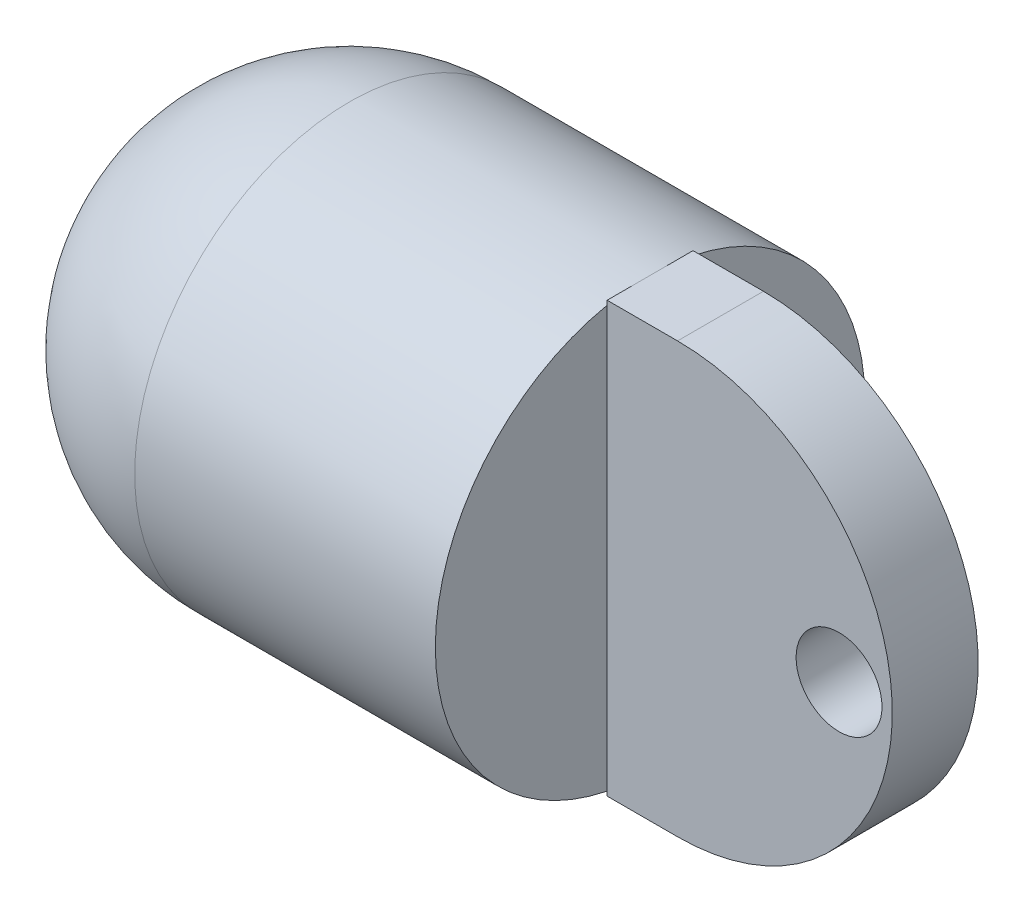
ISO-10303-21;
HEADER;
FILE_DESCRIPTION(('STEP AP214'),'2;1');
FILE_NAME('part.step','',(''),(''),'','','');
FILE_SCHEMA(('AUTOMOTIVE_DESIGN { 1 0 10303 214 1 1 1 1 }'));
ENDSEC;
DATA;
#1=APPLICATION_CONTEXT('core data for automotive mechanical design processes');
#2=APPLICATION_PROTOCOL_DEFINITION('international standard','automotive_design',2000,#1);
#3=PRODUCT_CONTEXT('',#1,'mechanical');
#4=PRODUCT('Part','Part','',(#3));
#5=PRODUCT_RELATED_PRODUCT_CATEGORY('part','',(#4));
#6=PRODUCT_DEFINITION_FORMATION('','',#4);
#7=PRODUCT_DEFINITION_CONTEXT('part definition',#1,'design');
#8=PRODUCT_DEFINITION('design','',#6,#7);
#9=PRODUCT_DEFINITION_SHAPE('','',#8);
#10=(LENGTH_UNIT() NAMED_UNIT(*) SI_UNIT(.MILLI.,.METRE.));
#11=(NAMED_UNIT(*) PLANE_ANGLE_UNIT() SI_UNIT($,.RADIAN.));
#12=(NAMED_UNIT(*) SI_UNIT($,.STERADIAN.) SOLID_ANGLE_UNIT());
#13=UNCERTAINTY_MEASURE_WITH_UNIT(LENGTH_MEASURE(1.E-05),#10,'distance_accuracy_value','');
#14=(GEOMETRIC_REPRESENTATION_CONTEXT(3) GLOBAL_UNCERTAINTY_ASSIGNED_CONTEXT((#13)) GLOBAL_UNIT_ASSIGNED_CONTEXT((#10,
#11,#12)) REPRESENTATION_CONTEXT('',''));
#15=CARTESIAN_POINT('',(0.,0.,0.));
#16=DIRECTION('',(0.,0.,1.));
#17=DIRECTION('',(1.,0.,0.));
#18=AXIS2_PLACEMENT_3D('',#15,#16,#17);
#19=CARTESIAN_POINT('',(0.,0.,0.));
#20=DIRECTION('',(1.,0.,0.));
#21=DIRECTION('',(0.,0.,-1.));
#22=AXIS2_PLACEMENT_3D('',#19,#20,#21);
#23=PLANE('',#22);
#24=DIRECTION('',(0.,1.,0.));
#25=VECTOR('',#24,1.);
#26=CARTESIAN_POINT('',(0.,12.5,-2.5));
#27=LINE('',#26,#25);
#28=CARTESIAN_POINT('',(0.,-12.2474487139159,-2.5));
#29=VERTEX_POINT('',#28);
#30=CARTESIAN_POINT('',(0.,12.2474487139159,-2.5));
#31=VERTEX_POINT('',#30);
#32=EDGE_CURVE('E11',#29,#31,#27,.T.);
#33=ORIENTED_EDGE('',*,*,#32,.F.);
#34=CARTESIAN_POINT('',(0.,0.,0.));
#35=DIRECTION('',(1.,0.,0.));
#36=DIRECTION('',(0.,0.,-1.));
#37=AXIS2_PLACEMENT_3D('',#34,#35,#36);
#38=CIRCLE('',#37,12.5);
#39=EDGE_CURVE('E165',#29,#31,#38,.T.);
#40=ORIENTED_EDGE('',*,*,#39,.T.);
#41=EDGE_LOOP('',(#33,#40));
#42=FACE_BOUND('',#41,.T.);
#43=ADVANCED_FACE('F39',(#42),#23,.T.);
#44=CARTESIAN_POINT('',(-17.5,0.,0.));
#45=DIRECTION('',(1.,0.,0.));
#46=DIRECTION('',(0.,0.,-1.));
#47=AXIS2_PLACEMENT_3D('',#44,#45,#46);
#48=CYLINDRICAL_SURFACE('',#47,12.5);
#49=CARTESIAN_POINT('',(-17.5,0.,0.));
#50=DIRECTION('',(1.,0.,0.));
#51=DIRECTION('',(0.,0.,-1.));
#52=AXIS2_PLACEMENT_3D('',#49,#50,#51);
#53=CIRCLE('',#52,12.5);
#54=CARTESIAN_POINT('',(-17.4999999999999,0.,-12.5));
#55=VERTEX_POINT('',#54);
#56=EDGE_CURVE('E243',#55,#55,#53,.T.);
#57=ORIENTED_EDGE('',*,*,#56,.T.);
#58=EDGE_LOOP('',(#57));
#59=FACE_BOUND('',#58,.T.);
#60=CARTESIAN_POINT('',(0.,12.5,0.));
#61=VERTEX_POINT('',#60);
#62=EDGE_CURVE('E166',#31,#61,#38,.T.);
#63=ORIENTED_EDGE('',*,*,#62,.F.);
#64=ORIENTED_EDGE('',*,*,#39,.F.);
#65=CARTESIAN_POINT('',(0.,-12.5,0.));
#66=VERTEX_POINT('',#65);
#67=EDGE_CURVE('E63',#66,#29,#38,.T.);
#68=ORIENTED_EDGE('',*,*,#67,.F.);
#69=CARTESIAN_POINT('',(0.,-12.2474487139159,2.5));
#70=VERTEX_POINT('',#69);
#71=EDGE_CURVE('E181',#70,#66,#38,.T.);
#72=ORIENTED_EDGE('',*,*,#71,.F.);
#73=CARTESIAN_POINT('',(0.,12.2474487139159,2.5));
#74=VERTEX_POINT('',#73);
#75=EDGE_CURVE('E178',#74,#70,#38,.T.);
#76=ORIENTED_EDGE('',*,*,#75,.F.);
#77=EDGE_CURVE('E169',#61,#74,#38,.T.);
#78=ORIENTED_EDGE('',*,*,#77,.F.);
#79=EDGE_LOOP('',(#63,#64,#68,#72,#76,#78));
#80=FACE_BOUND('',#79,.T.);
#81=ADVANCED_FACE('F41',(#59,#80),#48,.T.);
#82=DIRECTION('',(0.,-1.,0.));
#83=VECTOR('',#82,1.);
#84=CARTESIAN_POINT('',(0.,12.5,2.5));
#85=LINE('',#84,#83);
#86=EDGE_CURVE('E49',#74,#70,#85,.T.);
#87=ORIENTED_EDGE('',*,*,#86,.F.);
#88=ORIENTED_EDGE('',*,*,#75,.T.);
#89=EDGE_LOOP('',(#87,#88));
#90=FACE_BOUND('',#89,.T.);
#91=ADVANCED_FACE('F190',(#90),#23,.T.);
#92=CARTESIAN_POINT('',(0.,0.,0.));
#93=DIRECTION('',(-1.,0.,0.));
#94=DIRECTION('',(0.,0.,1.));
#95=AXIS2_PLACEMENT_3D('',#92,#93,#94);
#96=PLANE('',#95);
#97=CARTESIAN_POINT('',(0.,12.5,-2.5));
#98=VERTEX_POINT('',#97);
#99=EDGE_CURVE('E52',#31,#98,#27,.T.);
#100=ORIENTED_EDGE('',*,*,#99,.F.);
#101=ORIENTED_EDGE('',*,*,#62,.T.);
#102=DIRECTION('',(0.,0.,1.));
#103=VECTOR('',#102,1.);
#104=CARTESIAN_POINT('',(0.,12.5,2.5));
#105=LINE('',#104,#103);
#106=EDGE_CURVE('E146',#98,#61,#105,.T.);
#107=ORIENTED_EDGE('',*,*,#106,.F.);
#108=EDGE_LOOP('',(#100,#101,#107));
#109=FACE_BOUND('',#108,.T.);
#110=ADVANCED_FACE('F196',(#109),#96,.T.);
#111=CARTESIAN_POINT('',(0.,12.5,2.5));
#112=VERTEX_POINT('',#111);
#113=EDGE_CURVE('E139',#61,#112,#105,.T.);
#114=ORIENTED_EDGE('',*,*,#113,.F.);
#115=ORIENTED_EDGE('',*,*,#77,.T.);
#116=EDGE_CURVE('E150',#112,#74,#85,.T.);
#117=ORIENTED_EDGE('',*,*,#116,.F.);
#118=EDGE_LOOP('',(#114,#115,#117));
#119=FACE_BOUND('',#118,.T.);
#120=ADVANCED_FACE('F195',(#119),#96,.T.);
#121=CARTESIAN_POINT('',(0.,-12.5,2.5));
#122=VERTEX_POINT('',#121);
#123=EDGE_CURVE('E126',#70,#122,#85,.T.);
#124=ORIENTED_EDGE('',*,*,#123,.F.);
#125=ORIENTED_EDGE('',*,*,#71,.T.);
#126=DIRECTION('',(0.,0.,-1.));
#127=VECTOR('',#126,1.);
#128=CARTESIAN_POINT('',(0.,-12.5,2.5));
#129=LINE('',#128,#127);
#130=EDGE_CURVE('E154',#122,#66,#129,.T.);
#131=ORIENTED_EDGE('',*,*,#130,.F.);
#132=EDGE_LOOP('',(#124,#125,#131));
#133=FACE_BOUND('',#132,.T.);
#134=ADVANCED_FACE('F191',(#133),#96,.T.);
#135=CARTESIAN_POINT('',(4.1,12.5,2.5));
#136=DIRECTION('',(0.,-1.,0.));
#137=DIRECTION('',(0.,0.,-1.));
#138=AXIS2_PLACEMENT_3D('',#135,#136,#137);
#139=PLANE('',#138);
#140=ORIENTED_EDGE('',*,*,#106,.T.);
#141=ORIENTED_EDGE('',*,*,#113,.T.);
#142=DIRECTION('',(-1.,0.,0.));
#143=VECTOR('',#142,1.);
#144=CARTESIAN_POINT('',(4.1,12.5,2.5));
#145=LINE('',#144,#143);
#146=CARTESIAN_POINT('',(4.1,12.5,2.5));
#147=VERTEX_POINT('',#146);
#148=EDGE_CURVE('E128',#147,#112,#145,.T.);
#149=ORIENTED_EDGE('',*,*,#148,.F.);
#150=DIRECTION('',(0.,0.,1.));
#151=VECTOR('',#150,1.);
#152=CARTESIAN_POINT('',(4.1,12.5,2.5));
#153=LINE('',#152,#151);
#154=CARTESIAN_POINT('',(4.1,12.5,-2.5));
#155=VERTEX_POINT('',#154);
#156=EDGE_CURVE('E116',#155,#147,#153,.T.);
#157=ORIENTED_EDGE('',*,*,#156,.F.);
#158=DIRECTION('',(-1.,0.,0.));
#159=VECTOR('',#158,1.);
#160=CARTESIAN_POINT('',(4.1,12.5,-2.5));
#161=LINE('',#160,#159);
#162=EDGE_CURVE('E115',#155,#98,#161,.T.);
#163=ORIENTED_EDGE('',*,*,#162,.T.);
#164=EDGE_LOOP('',(#140,#141,#149,#157,#163));
#165=FACE_BOUND('',#164,.T.);
#166=ADVANCED_FACE('F204',(#165),#139,.F.);
#167=CARTESIAN_POINT('',(4.1,12.5,2.5));
#168=DIRECTION('',(0.,0.,-1.));
#169=DIRECTION('',(0.,1.,0.));
#170=AXIS2_PLACEMENT_3D('',#167,#168,#169);
#171=PLANE('',#170);
#172=CARTESIAN_POINT('',(13.5,0.,2.5));
#173=DIRECTION('',(0.,0.,-1.));
#174=DIRECTION('',(0.,1.,0.));
#175=AXIS2_PLACEMENT_3D('',#172,#173,#174);
#176=CIRCLE('',#175,2.5);
#177=CARTESIAN_POINT('',(13.5,2.5,2.5));
#178=VERTEX_POINT('',#177);
#179=EDGE_CURVE('E135',#178,#178,#176,.T.);
#180=ORIENTED_EDGE('',*,*,#179,.T.);
#181=EDGE_LOOP('',(#180));
#182=FACE_BOUND('',#181,.T.);
#183=ORIENTED_EDGE('',*,*,#116,.T.);
#184=ORIENTED_EDGE('',*,*,#86,.T.);
#185=ORIENTED_EDGE('',*,*,#123,.T.);
#186=DIRECTION('',(-1.,0.,0.));
#187=VECTOR('',#186,1.);
#188=CARTESIAN_POINT('',(4.1,-12.5,2.5));
#189=LINE('',#188,#187);
#190=CARTESIAN_POINT('',(4.1,-12.5,2.5));
#191=VERTEX_POINT('',#190);
#192=EDGE_CURVE('E106',#191,#122,#189,.T.);
#193=ORIENTED_EDGE('',*,*,#192,.F.);
#194=CARTESIAN_POINT('',(4.1,0.,2.5));
#195=DIRECTION('',(0.,0.,1.));
#196=DIRECTION('',(1.,0.,0.));
#197=AXIS2_PLACEMENT_3D('',#194,#195,#196);
#198=CIRCLE('',#197,12.5);
#199=EDGE_CURVE('E123',#191,#147,#198,.T.);
#200=ORIENTED_EDGE('',*,*,#199,.T.);
#201=ORIENTED_EDGE('',*,*,#148,.T.);
#202=EDGE_LOOP('',(#183,#184,#185,#193,#200,#201));
#203=FACE_BOUND('',#202,.T.);
#204=ADVANCED_FACE('F121',(#182,#203),#171,.F.);
#205=CARTESIAN_POINT('',(4.1,-12.5,2.5));
#206=DIRECTION('',(0.,1.,0.));
#207=DIRECTION('',(0.,0.,1.));
#208=AXIS2_PLACEMENT_3D('',#205,#206,#207);
#209=PLANE('',#208);
#210=ORIENTED_EDGE('',*,*,#130,.T.);
#211=CARTESIAN_POINT('',(0.,-12.5,-2.5));
#212=VERTEX_POINT('',#211);
#213=EDGE_CURVE('E153',#66,#212,#129,.T.);
#214=ORIENTED_EDGE('',*,*,#213,.T.);
#215=DIRECTION('',(-1.,0.,0.));
#216=VECTOR('',#215,1.);
#217=CARTESIAN_POINT('',(4.1,-12.5,-2.5));
#218=LINE('',#217,#216);
#219=CARTESIAN_POINT('',(4.1,-12.5,-2.5));
#220=VERTEX_POINT('',#219);
#221=EDGE_CURVE('E109',#220,#212,#218,.T.);
#222=ORIENTED_EDGE('',*,*,#221,.F.);
#223=DIRECTION('',(0.,0.,-1.));
#224=VECTOR('',#223,1.);
#225=CARTESIAN_POINT('',(4.1,-12.5,2.5));
#226=LINE('',#225,#224);
#227=EDGE_CURVE('E102',#191,#220,#226,.T.);
#228=ORIENTED_EDGE('',*,*,#227,.F.);
#229=ORIENTED_EDGE('',*,*,#192,.T.);
#230=EDGE_LOOP('',(#210,#214,#222,#228,#229));
#231=FACE_BOUND('',#230,.T.);
#232=ADVANCED_FACE('F105',(#231),#209,.F.);
#233=CARTESIAN_POINT('',(4.1,12.5,-2.5));
#234=DIRECTION('',(0.,0.,1.));
#235=DIRECTION('',(0.,-1.,0.));
#236=AXIS2_PLACEMENT_3D('',#233,#234,#235);
#237=PLANE('',#236);
#238=CARTESIAN_POINT('',(13.5,0.,-2.5));
#239=DIRECTION('',(0.,0.,1.));
#240=DIRECTION('',(0.,-1.,0.));
#241=AXIS2_PLACEMENT_3D('',#238,#239,#240);
#242=CIRCLE('',#241,2.5);
#243=CARTESIAN_POINT('',(13.5,-2.5,-2.5));
#244=VERTEX_POINT('',#243);
#245=EDGE_CURVE('E43',#244,#244,#242,.T.);
#246=ORIENTED_EDGE('',*,*,#245,.T.);
#247=EDGE_LOOP('',(#246));
#248=FACE_BOUND('',#247,.T.);
#249=EDGE_CURVE('E51',#212,#29,#27,.T.);
#250=ORIENTED_EDGE('',*,*,#249,.T.);
#251=ORIENTED_EDGE('',*,*,#32,.T.);
#252=ORIENTED_EDGE('',*,*,#99,.T.);
#253=ORIENTED_EDGE('',*,*,#162,.F.);
#254=CARTESIAN_POINT('',(4.1,0.,-2.5));
#255=DIRECTION('',(0.,0.,1.));
#256=DIRECTION('',(1.,0.,0.));
#257=AXIS2_PLACEMENT_3D('',#254,#255,#256);
#258=CIRCLE('',#257,12.5);
#259=EDGE_CURVE('E134',#220,#155,#258,.T.);
#260=ORIENTED_EDGE('',*,*,#259,.F.);
#261=ORIENTED_EDGE('',*,*,#221,.T.);
#262=EDGE_LOOP('',(#250,#251,#252,#253,#260,#261));
#263=FACE_BOUND('',#262,.T.);
#264=ADVANCED_FACE('F199',(#248,#263),#237,.F.);
#265=ORIENTED_EDGE('',*,*,#213,.F.);
#266=ORIENTED_EDGE('',*,*,#67,.T.);
#267=ORIENTED_EDGE('',*,*,#249,.F.);
#268=EDGE_LOOP('',(#265,#266,#267));
#269=FACE_BOUND('',#268,.T.);
#270=ADVANCED_FACE('F200',(#269),#96,.T.);
#271=CARTESIAN_POINT('',(4.1,0.,-2.5));
#272=DIRECTION('',(0.,0.,1.));
#273=DIRECTION('',(1.,0.,0.));
#274=AXIS2_PLACEMENT_3D('',#271,#272,#273);
#275=CYLINDRICAL_SURFACE('',#274,12.5);
#276=ORIENTED_EDGE('',*,*,#199,.F.);
#277=ORIENTED_EDGE('',*,*,#227,.T.);
#278=ORIENTED_EDGE('',*,*,#259,.T.);
#279=ORIENTED_EDGE('',*,*,#156,.T.);
#280=EDGE_LOOP('',(#276,#277,#278,#279));
#281=FACE_BOUND('',#280,.T.);
#282=ADVANCED_FACE('F131',(#281),#275,.T.);
#283=CARTESIAN_POINT('',(13.5,0.,-12.5));
#284=DIRECTION('',(0.,0.,1.));
#285=DIRECTION('',(1.,0.,0.));
#286=AXIS2_PLACEMENT_3D('',#283,#284,#285);
#287=CYLINDRICAL_SURFACE('',#286,2.5);
#288=ORIENTED_EDGE('',*,*,#245,.F.);
#289=EDGE_LOOP('',(#288));
#290=FACE_BOUND('',#289,.T.);
#291=ORIENTED_EDGE('',*,*,#179,.F.);
#292=EDGE_LOOP('',(#291));
#293=FACE_BOUND('',#292,.T.);
#294=ADVANCED_FACE('F233',(#290,#293),#287,.F.);
#295=CARTESIAN_POINT('',(-17.5,0.,0.));
#296=DIRECTION('',(0.,1.,0.));
#297=DIRECTION('',(0.,0.,-1.));
#298=AXIS2_PLACEMENT_3D('',#295,#296,#297);
#299=SPHERICAL_SURFACE('',#298,12.5);
#300=CARTESIAN_POINT('',(-17.5,0.,0.));
#301=DIRECTION('',(1.,0.,0.));
#302=DIRECTION('',(0.,0.,-1.));
#303=AXIS2_PLACEMENT_3D('',#300,#301,#302);
#304=SPHERICAL_SURFACE('',#303,12.5);
#305=ORIENTED_EDGE('',*,*,#56,.F.);
#306=EDGE_LOOP('',(#305));
#307=FACE_BOUND('',#306,.T.);
#308=ADVANCED_FACE('F249',(#307),#304,.T.);
#309=CLOSED_SHELL('',(#43,#81,#91,#110,#120,#134,#166,#204,#232,#264,#270,#282,#294,#308));
#310=MANIFOLD_SOLID_BREP('B2',#309);
#311=ADVANCED_BREP_SHAPE_REPRESENTATION('',(#18,#310),#14);
#312=SHAPE_DEFINITION_REPRESENTATION(#9,#311);
ENDSEC;
END-ISO-10303-21;
